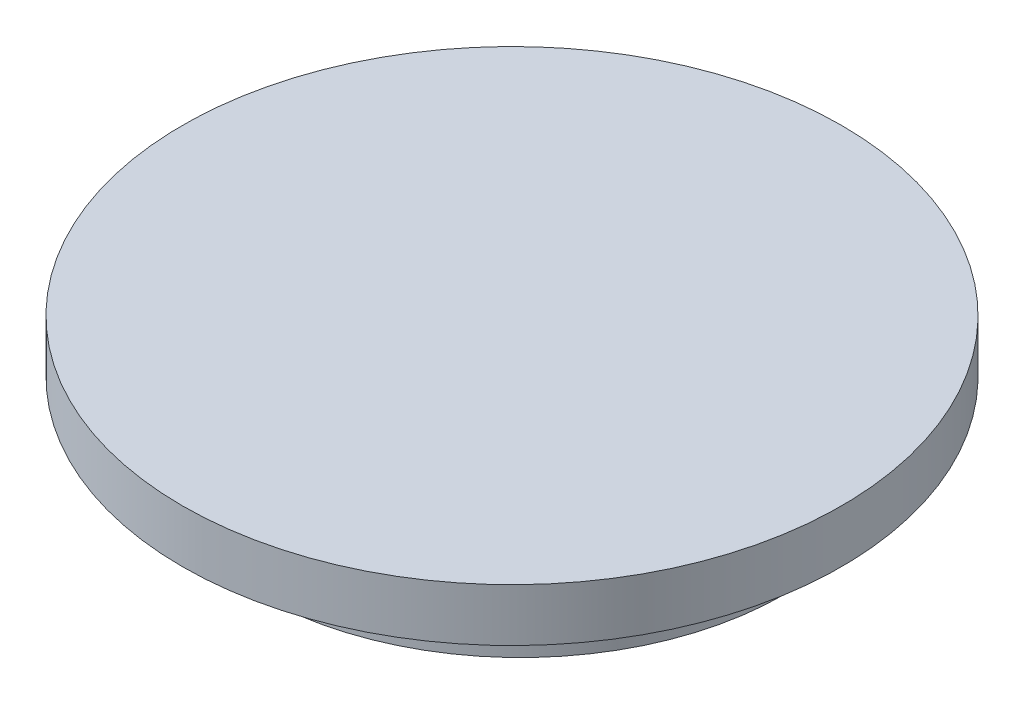
ISO-10303-21;
HEADER;
FILE_DESCRIPTION(('STEP AP214'),'2;1');
FILE_NAME('part.step','',(''),(''),'','','');
FILE_SCHEMA(('AUTOMOTIVE_DESIGN { 1 0 10303 214 1 1 1 1 }'));
ENDSEC;
DATA;
#1=APPLICATION_CONTEXT('core data for automotive mechanical design processes');
#2=APPLICATION_PROTOCOL_DEFINITION('international standard','automotive_design',2000,#1);
#3=PRODUCT_CONTEXT('',#1,'mechanical');
#4=PRODUCT('Part','Part','',(#3));
#5=PRODUCT_RELATED_PRODUCT_CATEGORY('part','',(#4));
#6=PRODUCT_DEFINITION_FORMATION('','',#4);
#7=PRODUCT_DEFINITION_CONTEXT('part definition',#1,'design');
#8=PRODUCT_DEFINITION('design','',#6,#7);
#9=PRODUCT_DEFINITION_SHAPE('','',#8);
#10=(LENGTH_UNIT() NAMED_UNIT(*) SI_UNIT(.MILLI.,.METRE.));
#11=(NAMED_UNIT(*) PLANE_ANGLE_UNIT() SI_UNIT($,.RADIAN.));
#12=(NAMED_UNIT(*) SI_UNIT($,.STERADIAN.) SOLID_ANGLE_UNIT());
#13=UNCERTAINTY_MEASURE_WITH_UNIT(LENGTH_MEASURE(1.E-05),#10,'distance_accuracy_value','');
#14=(GEOMETRIC_REPRESENTATION_CONTEXT(3) GLOBAL_UNCERTAINTY_ASSIGNED_CONTEXT((#13)) GLOBAL_UNIT_ASSIGNED_CONTEXT((#10,
#11,#12)) REPRESENTATION_CONTEXT('',''));
#15=CARTESIAN_POINT('',(0.,0.,0.));
#16=DIRECTION('',(0.,0.,1.));
#17=DIRECTION('',(1.,0.,0.));
#18=AXIS2_PLACEMENT_3D('',#15,#16,#17);
#19=CARTESIAN_POINT('',(0.,4.,0.));
#20=DIRECTION('',(0.,-1.,0.));
#21=DIRECTION('',(0.,0.,-1.));
#22=AXIS2_PLACEMENT_3D('',#19,#20,#21);
#23=CYLINDRICAL_SURFACE('',#22,20.);
#24=CARTESIAN_POINT('',(0.,4.,0.));
#25=DIRECTION('',(0.,1.,0.));
#26=DIRECTION('',(0.,0.,1.));
#27=AXIS2_PLACEMENT_3D('',#24,#25,#26);
#28=CIRCLE('',#27,20.);
#29=CARTESIAN_POINT('',(0.,4.,20.));
#30=VERTEX_POINT('',#29);
#31=EDGE_CURVE('E10',#30,#30,#28,.T.);
#32=ORIENTED_EDGE('',*,*,#31,.F.);
#33=EDGE_LOOP('',(#32));
#34=FACE_BOUND('',#33,.T.);
#35=CARTESIAN_POINT('',(0.,0.,0.));
#36=DIRECTION('',(0.,1.,0.));
#37=DIRECTION('',(0.,0.,1.));
#38=AXIS2_PLACEMENT_3D('',#35,#36,#37);
#39=CIRCLE('',#38,20.);
#40=CARTESIAN_POINT('',(0.,0.,20.));
#41=VERTEX_POINT('',#40);
#42=EDGE_CURVE('E34',#41,#41,#39,.T.);
#43=ORIENTED_EDGE('',*,*,#42,.T.);
#44=EDGE_LOOP('',(#43));
#45=FACE_BOUND('',#44,.T.);
#46=ADVANCED_FACE('F31',(#34,#45),#23,.T.);
#47=CARTESIAN_POINT('',(0.,0.,0.));
#48=DIRECTION('',(0.,1.,0.));
#49=DIRECTION('',(0.,0.,1.));
#50=AXIS2_PLACEMENT_3D('',#47,#48,#49);
#51=PLANE('',#50);
#52=ORIENTED_EDGE('',*,*,#42,.F.);
#53=EDGE_LOOP('',(#52));
#54=FACE_BOUND('',#53,.T.);
#55=ADVANCED_FACE('F54',(#54),#51,.F.);
#56=CARTESIAN_POINT('',(-0.65,8.,0.));
#57=DIRECTION('',(0.,-1.,0.));
#58=DIRECTION('',(0.,0.,-1.));
#59=AXIS2_PLACEMENT_3D('',#56,#57,#58);
#60=CYLINDRICAL_SURFACE('',#59,25.);
#61=CARTESIAN_POINT('',(-0.65,8.,0.));
#62=DIRECTION('',(0.,1.,0.));
#63=DIRECTION('',(0.,0.,1.));
#64=AXIS2_PLACEMENT_3D('',#61,#62,#63);
#65=CIRCLE('',#64,25.);
#66=CARTESIAN_POINT('',(-0.65,8.,25.));
#67=VERTEX_POINT('',#66);
#68=EDGE_CURVE('E41',#67,#67,#65,.T.);
#69=ORIENTED_EDGE('',*,*,#68,.F.);
#70=EDGE_LOOP('',(#69));
#71=FACE_BOUND('',#70,.T.);
#72=CARTESIAN_POINT('',(-0.65,4.,0.));
#73=DIRECTION('',(0.,1.,0.));
#74=DIRECTION('',(0.,0.,1.));
#75=AXIS2_PLACEMENT_3D('',#72,#73,#74);
#76=CIRCLE('',#75,25.);
#77=CARTESIAN_POINT('',(-0.65,4.,25.));
#78=VERTEX_POINT('',#77);
#79=EDGE_CURVE('E43',#78,#78,#76,.T.);
#80=ORIENTED_EDGE('',*,*,#79,.T.);
#81=EDGE_LOOP('',(#80));
#82=FACE_BOUND('',#81,.T.);
#83=ADVANCED_FACE('F51',(#71,#82),#60,.T.);
#84=CARTESIAN_POINT('',(-0.65,8.,0.));
#85=DIRECTION('',(0.,1.,0.));
#86=DIRECTION('',(0.,0.,1.));
#87=AXIS2_PLACEMENT_3D('',#84,#85,#86);
#88=PLANE('',#87);
#89=ORIENTED_EDGE('',*,*,#68,.T.);
#90=EDGE_LOOP('',(#89));
#91=FACE_BOUND('',#90,.T.);
#92=ADVANCED_FACE('F49',(#91),#88,.T.);
#93=CARTESIAN_POINT('',(-0.65,4.,0.));
#94=DIRECTION('',(0.,1.,0.));
#95=DIRECTION('',(0.,0.,1.));
#96=AXIS2_PLACEMENT_3D('',#93,#94,#95);
#97=PLANE('',#96);
#98=ORIENTED_EDGE('',*,*,#31,.T.);
#99=EDGE_LOOP('',(#98));
#100=FACE_BOUND('',#99,.T.);
#101=ORIENTED_EDGE('',*,*,#79,.F.);
#102=EDGE_LOOP('',(#101));
#103=FACE_BOUND('',#102,.T.);
#104=ADVANCED_FACE('F58',(#100,#103),#97,.F.);
#105=CLOSED_SHELL('',(#46,#55,#83,#92,#104));
#106=MANIFOLD_SOLID_BREP('B2',#105);
#107=ADVANCED_BREP_SHAPE_REPRESENTATION('',(#18,#106),#14);
#108=SHAPE_DEFINITION_REPRESENTATION(#9,#107);
ENDSEC;
END-ISO-10303-21;
